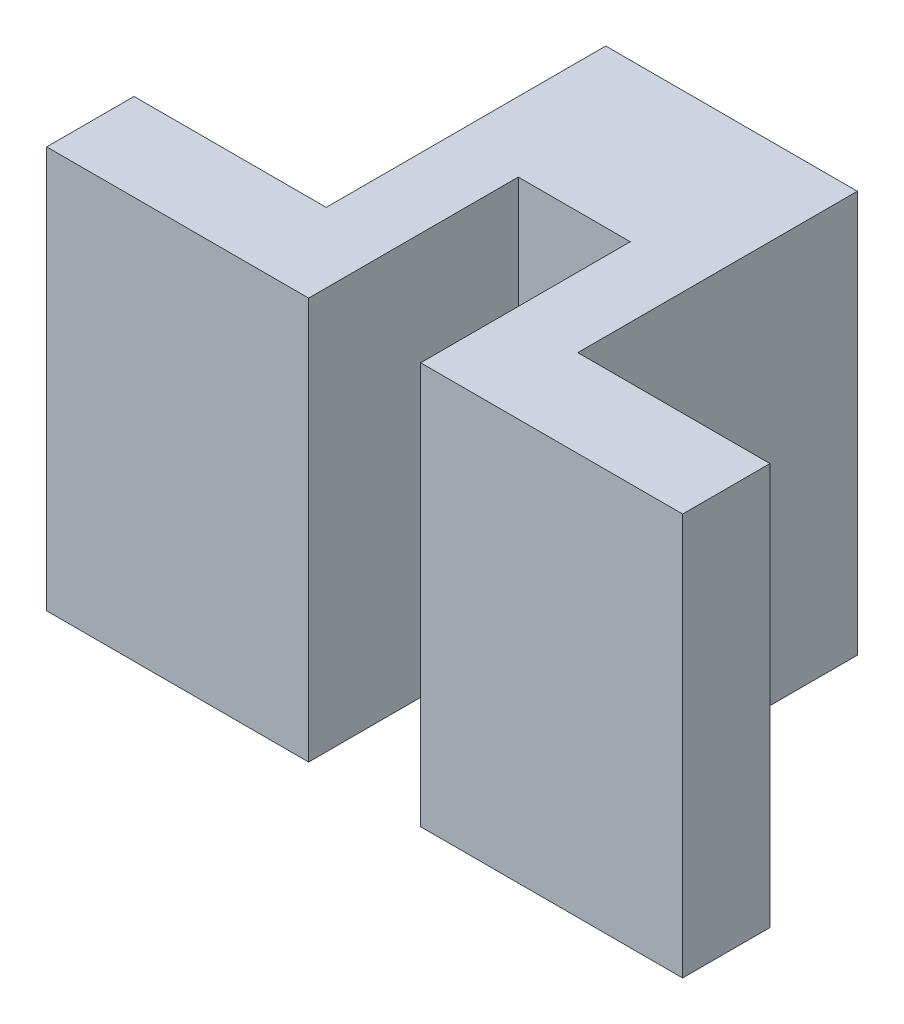
ISO-10303-21;
HEADER;
FILE_DESCRIPTION(('STEP AP214'),'2;1');
FILE_NAME('part.step','',(''),(''),'','','');
FILE_SCHEMA(('AUTOMOTIVE_DESIGN { 1 0 10303 214 1 1 1 1 }'));
ENDSEC;
DATA;
#1=APPLICATION_CONTEXT('core data for automotive mechanical design processes');
#2=APPLICATION_PROTOCOL_DEFINITION('international standard','automotive_design',2000,#1);
#3=PRODUCT_CONTEXT('',#1,'mechanical');
#4=PRODUCT('Part','Part','',(#3));
#5=PRODUCT_RELATED_PRODUCT_CATEGORY('part','',(#4));
#6=PRODUCT_DEFINITION_FORMATION('','',#4);
#7=PRODUCT_DEFINITION_CONTEXT('part definition',#1,'design');
#8=PRODUCT_DEFINITION('design','',#6,#7);
#9=PRODUCT_DEFINITION_SHAPE('','',#8);
#10=(LENGTH_UNIT() NAMED_UNIT(*) SI_UNIT(.MILLI.,.METRE.));
#11=(NAMED_UNIT(*) PLANE_ANGLE_UNIT() SI_UNIT($,.RADIAN.));
#12=(NAMED_UNIT(*) SI_UNIT($,.STERADIAN.) SOLID_ANGLE_UNIT());
#13=UNCERTAINTY_MEASURE_WITH_UNIT(LENGTH_MEASURE(1.E-05),#10,'distance_accuracy_value','');
#14=(GEOMETRIC_REPRESENTATION_CONTEXT(3) GLOBAL_UNCERTAINTY_ASSIGNED_CONTEXT((#13)) GLOBAL_UNIT_ASSIGNED_CONTEXT((#10,
#11,#12)) REPRESENTATION_CONTEXT('',''));
#15=CARTESIAN_POINT('',(0.,0.,0.));
#16=DIRECTION('',(0.,0.,1.));
#17=DIRECTION('',(1.,0.,0.));
#18=AXIS2_PLACEMENT_3D('',#15,#16,#17);
#19=CARTESIAN_POINT('',(0.,0.,1.25));
#20=DIRECTION('',(0.,0.,1.));
#21=DIRECTION('',(1.,0.,0.));
#22=AXIS2_PLACEMENT_3D('',#19,#20,#21);
#23=PLANE('',#22);
#24=DIRECTION('',(0.,-1.,0.));
#25=VECTOR('',#24,1.);
#26=CARTESIAN_POINT('',(-13.8516593096016,0.,1.25));
#27=LINE('',#26,#25);
#28=CARTESIAN_POINT('',(-13.8516593096016,14.25,1.25));
#29=VERTEX_POINT('',#28);
#30=CARTESIAN_POINT('',(-13.8516593096016,8.5,1.25));
#31=VERTEX_POINT('',#30);
#32=EDGE_CURVE('E41',#29,#31,#27,.T.);
#33=ORIENTED_EDGE('',*,*,#32,.F.);
#34=DIRECTION('',(-1.,0.,0.));
#35=VECTOR('',#34,1.);
#36=CARTESIAN_POINT('',(-8.50000000000001,14.25,1.25));
#37=LINE('',#36,#35);
#38=CARTESIAN_POINT('',(-17.6,14.25,1.25));
#39=VERTEX_POINT('',#38);
#40=EDGE_CURVE('E146',#29,#39,#37,.T.);
#41=ORIENTED_EDGE('',*,*,#40,.T.);
#42=DIRECTION('',(0.,-1.,0.));
#43=VECTOR('',#42,1.);
#44=CARTESIAN_POINT('',(-17.6,8.5,1.25));
#45=LINE('',#44,#43);
#46=CARTESIAN_POINT('',(-17.6,8.5,1.25));
#47=VERTEX_POINT('',#46);
#48=EDGE_CURVE('E145',#39,#47,#45,.T.);
#49=ORIENTED_EDGE('',*,*,#48,.T.);
#50=DIRECTION('',(1.,0.,0.));
#51=VECTOR('',#50,1.);
#52=CARTESIAN_POINT('',(-8.50000000000001,8.5,1.25));
#53=LINE('',#52,#51);
#54=EDGE_CURVE('E153',#47,#31,#53,.T.);
#55=ORIENTED_EDGE('',*,*,#54,.T.);
#56=EDGE_LOOP('',(#33,#41,#49,#55));
#57=FACE_BOUND('',#56,.T.);
#58=ADVANCED_FACE('F33',(#57),#23,.T.);
#59=CARTESIAN_POINT('',(0.,0.,0.));
#60=DIRECTION('',(0.,0.,1.));
#61=DIRECTION('',(1.,0.,0.));
#62=AXIS2_PLACEMENT_3D('',#59,#60,#61);
#63=PLANE('',#62);
#64=DIRECTION('',(0.,1.,0.));
#65=VECTOR('',#64,1.);
#66=CARTESIAN_POINT('',(-14.85,14.25,0.));
#67=LINE('',#66,#65);
#68=CARTESIAN_POINT('',(-14.85,8.5,0.));
#69=VERTEX_POINT('',#68);
#70=CARTESIAN_POINT('',(-14.85,14.25,0.));
#71=VERTEX_POINT('',#70);
#72=EDGE_CURVE('E200',#69,#71,#67,.T.);
#73=ORIENTED_EDGE('',*,*,#72,.F.);
#74=DIRECTION('',(1.,0.,0.));
#75=VECTOR('',#74,1.);
#76=CARTESIAN_POINT('',(-8.50000000000001,8.5,0.));
#77=LINE('',#76,#75);
#78=CARTESIAN_POINT('',(-17.6,8.5,0.));
#79=VERTEX_POINT('',#78);
#80=EDGE_CURVE('E167',#79,#69,#77,.T.);
#81=ORIENTED_EDGE('',*,*,#80,.F.);
#82=DIRECTION('',(0.,-1.,0.));
#83=VECTOR('',#82,1.);
#84=CARTESIAN_POINT('',(-17.6,8.5,0.));
#85=LINE('',#84,#83);
#86=CARTESIAN_POINT('',(-17.6,14.25,0.));
#87=VERTEX_POINT('',#86);
#88=EDGE_CURVE('E164',#87,#79,#85,.T.);
#89=ORIENTED_EDGE('',*,*,#88,.F.);
#90=DIRECTION('',(-1.,0.,0.));
#91=VECTOR('',#90,1.);
#92=CARTESIAN_POINT('',(-8.50000000000001,14.25,0.));
#93=LINE('',#92,#91);
#94=EDGE_CURVE('E56',#71,#87,#93,.T.);
#95=ORIENTED_EDGE('',*,*,#94,.F.);
#96=EDGE_LOOP('',(#73,#81,#89,#95));
#97=FACE_BOUND('',#96,.T.);
#98=ADVANCED_FACE('F198',(#97),#63,.F.);
#99=DIRECTION('',(0.,-1.,0.));
#100=VECTOR('',#99,1.);
#101=CARTESIAN_POINT('',(-11.25,14.25,0.));
#102=LINE('',#101,#100);
#103=CARTESIAN_POINT('',(-11.25,14.25,0.));
#104=VERTEX_POINT('',#103);
#105=CARTESIAN_POINT('',(-11.25,8.5,0.));
#106=VERTEX_POINT('',#105);
#107=EDGE_CURVE('E203',#104,#106,#102,.T.);
#108=ORIENTED_EDGE('',*,*,#107,.F.);
#109=CARTESIAN_POINT('',(-8.50000000000001,14.25,0.));
#110=VERTEX_POINT('',#109);
#111=EDGE_CURVE('E161',#110,#104,#93,.T.);
#112=ORIENTED_EDGE('',*,*,#111,.F.);
#113=DIRECTION('',(0.,1.,0.));
#114=VECTOR('',#113,1.);
#115=CARTESIAN_POINT('',(-8.50000000000001,8.5,0.));
#116=LINE('',#115,#114);
#117=CARTESIAN_POINT('',(-8.50000000000001,8.5,0.));
#118=VERTEX_POINT('',#117);
#119=EDGE_CURVE('E157',#118,#110,#116,.T.);
#120=ORIENTED_EDGE('',*,*,#119,.F.);
#121=EDGE_CURVE('E166',#106,#118,#77,.T.);
#122=ORIENTED_EDGE('',*,*,#121,.F.);
#123=EDGE_LOOP('',(#108,#112,#120,#122));
#124=FACE_BOUND('',#123,.T.);
#125=ADVANCED_FACE('F238',(#124),#63,.F.);
#126=CARTESIAN_POINT('',(-8.50000000000001,8.5,1.25));
#127=DIRECTION('',(-1.,0.,0.));
#128=DIRECTION('',(0.,0.,1.));
#129=AXIS2_PLACEMENT_3D('',#126,#127,#128);
#130=PLANE('',#129);
#131=ORIENTED_EDGE('',*,*,#119,.T.);
#132=DIRECTION('',(0.,0.,-1.));
#133=VECTOR('',#132,1.);
#134=CARTESIAN_POINT('',(-8.50000000000001,14.25,1.25));
#135=LINE('',#134,#133);
#136=CARTESIAN_POINT('',(-8.50000000000001,14.25,1.25));
#137=VERTEX_POINT('',#136);
#138=EDGE_CURVE('E128',#137,#110,#135,.T.);
#139=ORIENTED_EDGE('',*,*,#138,.F.);
#140=DIRECTION('',(0.,1.,0.));
#141=VECTOR('',#140,1.);
#142=CARTESIAN_POINT('',(-8.50000000000001,8.5,1.25));
#143=LINE('',#142,#141);
#144=CARTESIAN_POINT('',(-8.50000000000001,8.5,1.25));
#145=VERTEX_POINT('',#144);
#146=EDGE_CURVE('E143',#145,#137,#143,.T.);
#147=ORIENTED_EDGE('',*,*,#146,.F.);
#148=DIRECTION('',(0.,0.,-1.));
#149=VECTOR('',#148,1.);
#150=CARTESIAN_POINT('',(-8.50000000000001,8.5,1.25));
#151=LINE('',#150,#149);
#152=EDGE_CURVE('E156',#145,#118,#151,.T.);
#153=ORIENTED_EDGE('',*,*,#152,.T.);
#154=EDGE_LOOP('',(#131,#139,#147,#153));
#155=FACE_BOUND('',#154,.T.);
#156=ADVANCED_FACE('F35',(#155),#130,.F.);
#157=CARTESIAN_POINT('',(-8.50000000000001,14.25,1.25));
#158=DIRECTION('',(0.,-1.,0.));
#159=DIRECTION('',(0.,0.,-1.));
#160=AXIS2_PLACEMENT_3D('',#157,#158,#159);
#161=PLANE('',#160);
#162=ORIENTED_EDGE('',*,*,#40,.F.);
#163=DIRECTION('',(0.,0.,-1.));
#164=VECTOR('',#163,1.);
#165=CARTESIAN_POINT('',(-13.8516593096016,14.25,1.25));
#166=LINE('',#165,#164);
#167=CARTESIAN_POINT('',(-13.8516593096016,14.25,-1.75));
#168=VERTEX_POINT('',#167);
#169=EDGE_CURVE('E184',#29,#168,#166,.T.);
#170=ORIENTED_EDGE('',*,*,#169,.T.);
#171=DIRECTION('',(1.,0.,0.));
#172=VECTOR('',#171,1.);
#173=CARTESIAN_POINT('',(-8.50000000000001,14.25,-1.75));
#174=LINE('',#173,#172);
#175=CARTESIAN_POINT('',(-12.2483406903984,14.25,-1.75));
#176=VERTEX_POINT('',#175);
#177=EDGE_CURVE('E138',#168,#176,#174,.T.);
#178=ORIENTED_EDGE('',*,*,#177,.T.);
#179=DIRECTION('',(0.,0.,1.));
#180=VECTOR('',#179,1.);
#181=CARTESIAN_POINT('',(-12.2483406903984,14.25,1.25));
#182=LINE('',#181,#180);
#183=CARTESIAN_POINT('',(-12.2483406903984,14.25,1.25));
#184=VERTEX_POINT('',#183);
#185=EDGE_CURVE('E123',#176,#184,#182,.T.);
#186=ORIENTED_EDGE('',*,*,#185,.T.);
#187=EDGE_CURVE('E135',#137,#184,#37,.T.);
#188=ORIENTED_EDGE('',*,*,#187,.F.);
#189=ORIENTED_EDGE('',*,*,#138,.T.);
#190=ORIENTED_EDGE('',*,*,#111,.T.);
#191=DIRECTION('',(0.,0.,1.));
#192=VECTOR('',#191,1.);
#193=CARTESIAN_POINT('',(-11.25,14.25,-4.));
#194=LINE('',#193,#192);
#195=CARTESIAN_POINT('',(-11.25,14.25,-4.));
#196=VERTEX_POINT('',#195);
#197=EDGE_CURVE('E218',#196,#104,#194,.T.);
#198=ORIENTED_EDGE('',*,*,#197,.F.);
#199=DIRECTION('',(1.,0.,0.));
#200=VECTOR('',#199,1.);
#201=CARTESIAN_POINT('',(-14.85,14.25,-4.));
#202=LINE('',#201,#200);
#203=CARTESIAN_POINT('',(-14.85,14.25,-4.));
#204=VERTEX_POINT('',#203);
#205=EDGE_CURVE('E221',#204,#196,#202,.T.);
#206=ORIENTED_EDGE('',*,*,#205,.F.);
#207=DIRECTION('',(0.,0.,1.));
#208=VECTOR('',#207,1.);
#209=CARTESIAN_POINT('',(-14.85,14.25,-4.));
#210=LINE('',#209,#208);
#211=EDGE_CURVE('E160',#204,#71,#210,.T.);
#212=ORIENTED_EDGE('',*,*,#211,.T.);
#213=ORIENTED_EDGE('',*,*,#94,.T.);
#214=DIRECTION('',(0.,0.,-1.));
#215=VECTOR('',#214,1.);
#216=CARTESIAN_POINT('',(-17.6,14.25,1.25));
#217=LINE('',#216,#215);
#218=EDGE_CURVE('E175',#39,#87,#217,.T.);
#219=ORIENTED_EDGE('',*,*,#218,.F.);
#220=EDGE_LOOP('',(#162,#170,#178,#186,#188,#189,#190,#198,#206,#212,#213,#219));
#221=FACE_BOUND('',#220,.T.);
#222=ADVANCED_FACE('F133',(#221),#161,.F.);
#223=CARTESIAN_POINT('',(-17.6,8.5,1.25));
#224=DIRECTION('',(1.,0.,0.));
#225=DIRECTION('',(0.,0.,-1.));
#226=AXIS2_PLACEMENT_3D('',#223,#224,#225);
#227=PLANE('',#226);
#228=ORIENTED_EDGE('',*,*,#88,.T.);
#229=DIRECTION('',(0.,0.,-1.));
#230=VECTOR('',#229,1.);
#231=CARTESIAN_POINT('',(-17.6,8.5,1.25));
#232=LINE('',#231,#230);
#233=EDGE_CURVE('E172',#47,#79,#232,.T.);
#234=ORIENTED_EDGE('',*,*,#233,.F.);
#235=ORIENTED_EDGE('',*,*,#48,.F.);
#236=ORIENTED_EDGE('',*,*,#218,.T.);
#237=EDGE_LOOP('',(#228,#234,#235,#236));
#238=FACE_BOUND('',#237,.T.);
#239=ADVANCED_FACE('F194',(#238),#227,.F.);
#240=CARTESIAN_POINT('',(-8.50000000000001,8.5,1.25));
#241=DIRECTION('',(0.,1.,0.));
#242=DIRECTION('',(-1.,0.,0.));
#243=AXIS2_PLACEMENT_3D('',#240,#241,#242);
#244=PLANE('',#243);
#245=DIRECTION('',(-1.,0.,0.));
#246=VECTOR('',#245,1.);
#247=CARTESIAN_POINT('',(-8.50000000000001,8.5,-1.75));
#248=LINE('',#247,#246);
#249=CARTESIAN_POINT('',(-12.2483406903984,8.5,-1.75));
#250=VERTEX_POINT('',#249);
#251=CARTESIAN_POINT('',(-13.8516593096016,8.5,-1.75));
#252=VERTEX_POINT('',#251);
#253=EDGE_CURVE('E11',#250,#252,#248,.T.);
#254=ORIENTED_EDGE('',*,*,#253,.T.);
#255=DIRECTION('',(0.,0.,1.));
#256=VECTOR('',#255,1.);
#257=CARTESIAN_POINT('',(-13.8516593096016,8.5,1.25));
#258=LINE('',#257,#256);
#259=EDGE_CURVE('E139',#252,#31,#258,.T.);
#260=ORIENTED_EDGE('',*,*,#259,.T.);
#261=ORIENTED_EDGE('',*,*,#54,.F.);
#262=ORIENTED_EDGE('',*,*,#233,.T.);
#263=ORIENTED_EDGE('',*,*,#80,.T.);
#264=DIRECTION('',(0.,0.,1.));
#265=VECTOR('',#264,1.);
#266=CARTESIAN_POINT('',(-14.85,8.5,-4.));
#267=LINE('',#266,#265);
#268=CARTESIAN_POINT('',(-14.85,8.5,-4.));
#269=VERTEX_POINT('',#268);
#270=EDGE_CURVE('E213',#269,#69,#267,.T.);
#271=ORIENTED_EDGE('',*,*,#270,.F.);
#272=DIRECTION('',(-1.,0.,0.));
#273=VECTOR('',#272,1.);
#274=CARTESIAN_POINT('',(-14.85,8.5,-4.));
#275=LINE('',#274,#273);
#276=CARTESIAN_POINT('',(-11.25,8.5,-4.));
#277=VERTEX_POINT('',#276);
#278=EDGE_CURVE('E210',#277,#269,#275,.T.);
#279=ORIENTED_EDGE('',*,*,#278,.F.);
#280=DIRECTION('',(0.,0.,1.));
#281=VECTOR('',#280,1.);
#282=CARTESIAN_POINT('',(-11.25,8.5,-4.));
#283=LINE('',#282,#281);
#284=EDGE_CURVE('E215',#277,#106,#283,.T.);
#285=ORIENTED_EDGE('',*,*,#284,.T.);
#286=ORIENTED_EDGE('',*,*,#121,.T.);
#287=ORIENTED_EDGE('',*,*,#152,.F.);
#288=CARTESIAN_POINT('',(-12.2483406903984,8.5,1.25));
#289=VERTEX_POINT('',#288);
#290=EDGE_CURVE('E148',#289,#145,#53,.T.);
#291=ORIENTED_EDGE('',*,*,#290,.F.);
#292=DIRECTION('',(0.,0.,-1.));
#293=VECTOR('',#292,1.);
#294=CARTESIAN_POINT('',(-12.2483406903984,8.5,1.25));
#295=LINE('',#294,#293);
#296=EDGE_CURVE('E48',#289,#250,#295,.T.);
#297=ORIENTED_EDGE('',*,*,#296,.T.);
#298=EDGE_LOOP('',(#254,#260,#261,#262,#263,#271,#279,#285,#286,#287,#291,#297));
#299=FACE_BOUND('',#298,.T.);
#300=ADVANCED_FACE('F188',(#299),#244,.F.);
#301=DIRECTION('',(0.,1.,0.));
#302=VECTOR('',#301,1.);
#303=CARTESIAN_POINT('',(-12.2483406903984,0.,1.25));
#304=LINE('',#303,#302);
#305=EDGE_CURVE('E120',#289,#184,#304,.T.);
#306=ORIENTED_EDGE('',*,*,#305,.F.);
#307=ORIENTED_EDGE('',*,*,#290,.T.);
#308=ORIENTED_EDGE('',*,*,#146,.T.);
#309=ORIENTED_EDGE('',*,*,#187,.T.);
#310=EDGE_LOOP('',(#306,#307,#308,#309));
#311=FACE_BOUND('',#310,.T.);
#312=ADVANCED_FACE('F141',(#311),#23,.T.);
#313=CARTESIAN_POINT('',(-14.85,14.25,-4.));
#314=DIRECTION('',(1.,0.,0.));
#315=DIRECTION('',(0.,0.,-1.));
#316=AXIS2_PLACEMENT_3D('',#313,#314,#315);
#317=PLANE('',#316);
#318=ORIENTED_EDGE('',*,*,#72,.T.);
#319=ORIENTED_EDGE('',*,*,#211,.F.);
#320=DIRECTION('',(0.,1.,0.));
#321=VECTOR('',#320,1.);
#322=CARTESIAN_POINT('',(-14.85,14.25,-4.));
#323=LINE('',#322,#321);
#324=EDGE_CURVE('E206',#269,#204,#323,.T.);
#325=ORIENTED_EDGE('',*,*,#324,.F.);
#326=ORIENTED_EDGE('',*,*,#270,.T.);
#327=EDGE_LOOP('',(#318,#319,#325,#326));
#328=FACE_BOUND('',#327,.T.);
#329=ADVANCED_FACE('F224',(#328),#317,.F.);
#330=CARTESIAN_POINT('',(-11.25,14.25,-4.));
#331=DIRECTION('',(-1.,0.,0.));
#332=DIRECTION('',(0.,0.,1.));
#333=AXIS2_PLACEMENT_3D('',#330,#331,#332);
#334=PLANE('',#333);
#335=ORIENTED_EDGE('',*,*,#107,.T.);
#336=ORIENTED_EDGE('',*,*,#284,.F.);
#337=DIRECTION('',(0.,-1.,0.));
#338=VECTOR('',#337,1.);
#339=CARTESIAN_POINT('',(-11.25,14.25,-4.));
#340=LINE('',#339,#338);
#341=EDGE_CURVE('E227',#196,#277,#340,.T.);
#342=ORIENTED_EDGE('',*,*,#341,.F.);
#343=ORIENTED_EDGE('',*,*,#197,.T.);
#344=EDGE_LOOP('',(#335,#336,#342,#343));
#345=FACE_BOUND('',#344,.T.);
#346=ADVANCED_FACE('F236',(#345),#334,.F.);
#347=CARTESIAN_POINT('',(0.,0.,-4.));
#348=DIRECTION('',(0.,0.,1.));
#349=DIRECTION('',(1.,0.,0.));
#350=AXIS2_PLACEMENT_3D('',#347,#348,#349);
#351=PLANE('',#350);
#352=ORIENTED_EDGE('',*,*,#324,.T.);
#353=ORIENTED_EDGE('',*,*,#205,.T.);
#354=ORIENTED_EDGE('',*,*,#341,.T.);
#355=ORIENTED_EDGE('',*,*,#278,.T.);
#356=EDGE_LOOP('',(#352,#353,#354,#355));
#357=FACE_BOUND('',#356,.T.);
#358=ADVANCED_FACE('F233',(#357),#351,.F.);
#359=CARTESIAN_POINT('',(0.,0.,-1.75));
#360=DIRECTION('',(0.,0.,-1.));
#361=DIRECTION('',(-1.,0.,0.));
#362=AXIS2_PLACEMENT_3D('',#359,#360,#361);
#363=PLANE('',#362);
#364=DIRECTION('',(0.,-1.,0.));
#365=VECTOR('',#364,1.);
#366=CARTESIAN_POINT('',(-13.8516593096016,3.875,-1.75));
#367=LINE('',#366,#365);
#368=EDGE_CURVE('E243',#168,#252,#367,.T.);
#369=ORIENTED_EDGE('',*,*,#368,.T.);
#370=ORIENTED_EDGE('',*,*,#253,.F.);
#371=DIRECTION('',(0.,1.,0.));
#372=VECTOR('',#371,1.);
#373=CARTESIAN_POINT('',(-12.2483406903984,3.875,-1.75));
#374=LINE('',#373,#372);
#375=EDGE_CURVE('E241',#250,#176,#374,.T.);
#376=ORIENTED_EDGE('',*,*,#375,.T.);
#377=ORIENTED_EDGE('',*,*,#177,.F.);
#378=EDGE_LOOP('',(#369,#370,#376,#377));
#379=FACE_BOUND('',#378,.T.);
#380=ADVANCED_FACE('F247',(#379),#363,.F.);
#381=CARTESIAN_POINT('',(-13.8516593096016,3.875,-1.75));
#382=DIRECTION('',(-1.,0.,0.));
#383=DIRECTION('',(0.,0.,1.));
#384=AXIS2_PLACEMENT_3D('',#381,#382,#383);
#385=PLANE('',#384);
#386=ORIENTED_EDGE('',*,*,#32,.T.);
#387=ORIENTED_EDGE('',*,*,#259,.F.);
#388=ORIENTED_EDGE('',*,*,#368,.F.);
#389=ORIENTED_EDGE('',*,*,#169,.F.);
#390=EDGE_LOOP('',(#386,#387,#388,#389));
#391=FACE_BOUND('',#390,.T.);
#392=ADVANCED_FACE('F181',(#391),#385,.F.);
#393=CARTESIAN_POINT('',(-12.2483406903984,3.875,-1.75));
#394=DIRECTION('',(1.,0.,0.));
#395=DIRECTION('',(0.,0.,-1.));
#396=AXIS2_PLACEMENT_3D('',#393,#394,#395);
#397=PLANE('',#396);
#398=ORIENTED_EDGE('',*,*,#375,.F.);
#399=ORIENTED_EDGE('',*,*,#296,.F.);
#400=ORIENTED_EDGE('',*,*,#305,.T.);
#401=ORIENTED_EDGE('',*,*,#185,.F.);
#402=EDGE_LOOP('',(#398,#399,#400,#401));
#403=FACE_BOUND('',#402,.T.);
#404=ADVANCED_FACE('F122',(#403),#397,.F.);
#405=CLOSED_SHELL('',(#58,#98,#125,#156,#222,#239,#300,#312,#329,#346,#358,#380,#392,#404));
#406=MANIFOLD_SOLID_BREP('B2',#405);
#407=ADVANCED_BREP_SHAPE_REPRESENTATION('',(#18,#406),#14);
#408=SHAPE_DEFINITION_REPRESENTATION(#9,#407);
ENDSEC;
END-ISO-10303-21;
